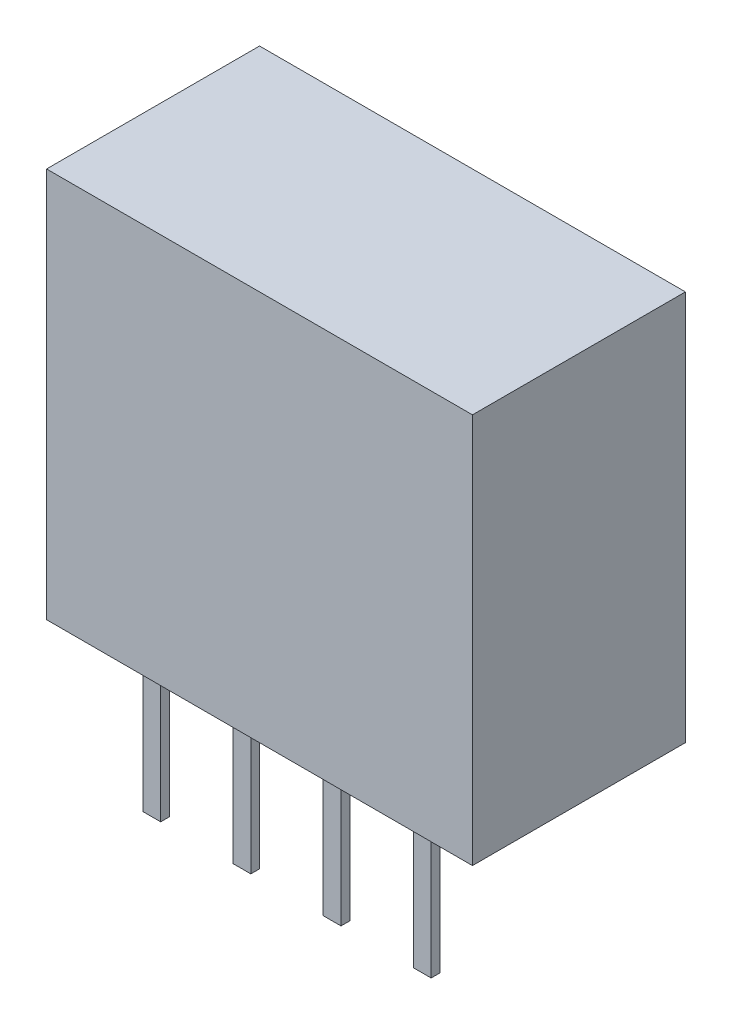
ISO-10303-21;
HEADER;
FILE_DESCRIPTION(('STEP AP214'),'2;1');
FILE_NAME('part.step','',(''),(''),'','','');
FILE_SCHEMA(('AUTOMOTIVE_DESIGN { 1 0 10303 214 1 1 1 1 }'));
ENDSEC;
DATA;
#1=APPLICATION_CONTEXT('core data for automotive mechanical design processes');
#2=APPLICATION_PROTOCOL_DEFINITION('international standard','automotive_design',2000,#1);
#3=PRODUCT_CONTEXT('',#1,'mechanical');
#4=PRODUCT('Part','Part','',(#3));
#5=PRODUCT_RELATED_PRODUCT_CATEGORY('part','',(#4));
#6=PRODUCT_DEFINITION_FORMATION('','',#4);
#7=PRODUCT_DEFINITION_CONTEXT('part definition',#1,'design');
#8=PRODUCT_DEFINITION('design','',#6,#7);
#9=PRODUCT_DEFINITION_SHAPE('','',#8);
#10=(LENGTH_UNIT() NAMED_UNIT(*) SI_UNIT(.MILLI.,.METRE.));
#11=(NAMED_UNIT(*) PLANE_ANGLE_UNIT() SI_UNIT($,.RADIAN.));
#12=(NAMED_UNIT(*) SI_UNIT($,.STERADIAN.) SOLID_ANGLE_UNIT());
#13=UNCERTAINTY_MEASURE_WITH_UNIT(LENGTH_MEASURE(1.E-05),#10,'distance_accuracy_value','');
#14=(GEOMETRIC_REPRESENTATION_CONTEXT(3) GLOBAL_UNCERTAINTY_ASSIGNED_CONTEXT((#13)) GLOBAL_UNIT_ASSIGNED_CONTEXT((#10,
#11,#12)) REPRESENTATION_CONTEXT('',''));
#15=CARTESIAN_POINT('',(0.,0.,0.));
#16=DIRECTION('',(0.,0.,1.));
#17=DIRECTION('',(1.,0.,0.));
#18=AXIS2_PLACEMENT_3D('',#15,#16,#17);
#19=CARTESIAN_POINT('',(-6.00000000000001,-5.5,6.));
#20=DIRECTION('',(0.,1.,0.));
#21=DIRECTION('',(0.,0.,1.));
#22=AXIS2_PLACEMENT_3D('',#19,#20,#21);
#23=PLANE('',#22);
#24=DIRECTION('',(0.,0.,1.));
#25=VECTOR('',#24,1.);
#26=CARTESIAN_POINT('',(-1.02000000000001,-5.5,5.22499999999997));
#27=LINE('',#26,#25);
#28=CARTESIAN_POINT('',(-1.02000000000001,-5.5,4.97499999999997));
#29=VERTEX_POINT('',#28);
#30=CARTESIAN_POINT('',(-1.02000000000001,-5.5,5.22499999999997));
#31=VERTEX_POINT('',#30);
#32=EDGE_CURVE('E191',#29,#31,#27,.T.);
#33=ORIENTED_EDGE('',*,*,#32,.F.);
#34=DIRECTION('',(1.,0.,0.));
#35=VECTOR('',#34,1.);
#36=CARTESIAN_POINT('',(-1.52000000000001,-5.5,4.97499999999997));
#37=LINE('',#36,#35);
#38=CARTESIAN_POINT('',(-1.52000000000001,-5.5,4.97499999999997));
#39=VERTEX_POINT('',#38);
#40=EDGE_CURVE('E204',#39,#29,#37,.T.);
#41=ORIENTED_EDGE('',*,*,#40,.F.);
#42=DIRECTION('',(0.,0.,-1.));
#43=VECTOR('',#42,1.);
#44=CARTESIAN_POINT('',(-1.52000000000001,-5.5,5.22499999999997));
#45=LINE('',#44,#43);
#46=CARTESIAN_POINT('',(-1.52000000000001,-5.5,5.22499999999997));
#47=VERTEX_POINT('',#46);
#48=EDGE_CURVE('E213',#47,#39,#45,.T.);
#49=ORIENTED_EDGE('',*,*,#48,.F.);
#50=DIRECTION('',(-1.,0.,0.));
#51=VECTOR('',#50,1.);
#52=CARTESIAN_POINT('',(-1.52000000000001,-5.5,5.22499999999997));
#53=LINE('',#52,#51);
#54=EDGE_CURVE('E194',#31,#47,#53,.T.);
#55=ORIENTED_EDGE('',*,*,#54,.F.);
#56=EDGE_LOOP('',(#33,#41,#49,#55));
#57=FACE_BOUND('',#56,.T.);
#58=DIRECTION('',(0.,0.,1.));
#59=VECTOR('',#58,1.);
#60=CARTESIAN_POINT('',(4.05999999999999,-5.5,5.225));
#61=LINE('',#60,#59);
#62=CARTESIAN_POINT('',(4.05999999999999,-5.5,4.975));
#63=VERTEX_POINT('',#62);
#64=CARTESIAN_POINT('',(4.05999999999999,-5.5,5.225));
#65=VERTEX_POINT('',#64);
#66=EDGE_CURVE('E262',#63,#65,#61,.T.);
#67=ORIENTED_EDGE('',*,*,#66,.F.);
#68=DIRECTION('',(1.,0.,0.));
#69=VECTOR('',#68,1.);
#70=CARTESIAN_POINT('',(3.55999999999999,-5.5,4.975));
#71=LINE('',#70,#69);
#72=CARTESIAN_POINT('',(3.55999999999999,-5.5,4.975));
#73=VERTEX_POINT('',#72);
#74=EDGE_CURVE('E267',#73,#63,#71,.T.);
#75=ORIENTED_EDGE('',*,*,#74,.F.);
#76=DIRECTION('',(0.,0.,-1.));
#77=VECTOR('',#76,1.);
#78=CARTESIAN_POINT('',(3.55999999999999,-5.5,5.225));
#79=LINE('',#78,#77);
#80=CARTESIAN_POINT('',(3.55999999999999,-5.5,5.225));
#81=VERTEX_POINT('',#80);
#82=EDGE_CURVE('E279',#81,#73,#79,.T.);
#83=ORIENTED_EDGE('',*,*,#82,.F.);
#84=DIRECTION('',(-1.,0.,0.));
#85=VECTOR('',#84,1.);
#86=CARTESIAN_POINT('',(3.55999999999999,-5.5,5.225));
#87=LINE('',#86,#85);
#88=EDGE_CURVE('E276',#65,#81,#87,.T.);
#89=ORIENTED_EDGE('',*,*,#88,.F.);
#90=EDGE_LOOP('',(#67,#75,#83,#89));
#91=FACE_BOUND('',#90,.T.);
#92=DIRECTION('',(1.,0.,0.));
#93=VECTOR('',#92,1.);
#94=CARTESIAN_POINT('',(-6.00000000000001,-5.5,0.));
#95=LINE('',#94,#93);
#96=CARTESIAN_POINT('',(-6.00000000000001,-5.5,0.));
#97=VERTEX_POINT('',#96);
#98=CARTESIAN_POINT('',(5.99999999999999,-5.5,0.));
#99=VERTEX_POINT('',#98);
#100=EDGE_CURVE('E300',#97,#99,#95,.T.);
#101=ORIENTED_EDGE('',*,*,#100,.T.);
#102=DIRECTION('',(0.,0.,-1.));
#103=VECTOR('',#102,1.);
#104=CARTESIAN_POINT('',(5.99999999999999,-5.5,6.));
#105=LINE('',#104,#103);
#106=CARTESIAN_POINT('',(5.99999999999999,-5.5,6.));
#107=VERTEX_POINT('',#106);
#108=EDGE_CURVE('E306',#107,#99,#105,.T.);
#109=ORIENTED_EDGE('',*,*,#108,.F.);
#110=DIRECTION('',(1.,0.,0.));
#111=VECTOR('',#110,1.);
#112=CARTESIAN_POINT('',(-6.00000000000001,-5.5,6.));
#113=LINE('',#112,#111);
#114=CARTESIAN_POINT('',(-6.00000000000001,-5.5,6.));
#115=VERTEX_POINT('',#114);
#116=EDGE_CURVE('E304',#115,#107,#113,.T.);
#117=ORIENTED_EDGE('',*,*,#116,.F.);
#118=DIRECTION('',(0.,0.,-1.));
#119=VECTOR('',#118,1.);
#120=CARTESIAN_POINT('',(-6.00000000000001,-5.5,6.));
#121=LINE('',#120,#119);
#122=EDGE_CURVE('E316',#115,#97,#121,.T.);
#123=ORIENTED_EDGE('',*,*,#122,.T.);
#124=EDGE_LOOP('',(#101,#109,#117,#123));
#125=FACE_BOUND('',#124,.T.);
#126=DIRECTION('',(0.,0.,1.));
#127=VECTOR('',#126,1.);
#128=CARTESIAN_POINT('',(1.51999999999999,-5.5,5.22499999999998));
#129=LINE('',#128,#127);
#130=CARTESIAN_POINT('',(1.51999999999999,-5.5,4.97499999999998));
#131=VERTEX_POINT('',#130);
#132=CARTESIAN_POINT('',(1.51999999999999,-5.5,5.22499999999998));
#133=VERTEX_POINT('',#132);
#134=EDGE_CURVE('E229',#131,#133,#129,.T.);
#135=ORIENTED_EDGE('',*,*,#134,.F.);
#136=DIRECTION('',(1.,0.,0.));
#137=VECTOR('',#136,1.);
#138=CARTESIAN_POINT('',(1.01999999999999,-5.5,4.97499999999998));
#139=LINE('',#138,#137);
#140=CARTESIAN_POINT('',(1.01999999999999,-5.5,4.97499999999998));
#141=VERTEX_POINT('',#140);
#142=EDGE_CURVE('E234',#141,#131,#139,.T.);
#143=ORIENTED_EDGE('',*,*,#142,.F.);
#144=DIRECTION('',(0.,0.,-1.));
#145=VECTOR('',#144,1.);
#146=CARTESIAN_POINT('',(1.01999999999999,-5.5,5.22499999999998));
#147=LINE('',#146,#145);
#148=CARTESIAN_POINT('',(1.01999999999999,-5.5,5.22499999999998));
#149=VERTEX_POINT('',#148);
#150=EDGE_CURVE('E246',#149,#141,#147,.T.);
#151=ORIENTED_EDGE('',*,*,#150,.F.);
#152=DIRECTION('',(-1.,0.,0.));
#153=VECTOR('',#152,1.);
#154=CARTESIAN_POINT('',(1.01999999999999,-5.5,5.22499999999998));
#155=LINE('',#154,#153);
#156=EDGE_CURVE('E243',#133,#149,#155,.T.);
#157=ORIENTED_EDGE('',*,*,#156,.F.);
#158=EDGE_LOOP('',(#135,#143,#151,#157));
#159=FACE_BOUND('',#158,.T.);
#160=DIRECTION('',(0.,0.,1.));
#161=VECTOR('',#160,1.);
#162=CARTESIAN_POINT('',(-3.56,-5.5,5.22499999999995));
#163=LINE('',#162,#161);
#164=CARTESIAN_POINT('',(-3.56,-5.5,4.97499999999995));
#165=VERTEX_POINT('',#164);
#166=CARTESIAN_POINT('',(-3.56,-5.5,5.22499999999995));
#167=VERTEX_POINT('',#166);
#168=EDGE_CURVE('E190',#165,#167,#163,.T.);
#169=ORIENTED_EDGE('',*,*,#168,.F.);
#170=DIRECTION('',(1.,0.,0.));
#171=VECTOR('',#170,1.);
#172=CARTESIAN_POINT('',(-4.06,-5.5,4.97499999999995));
#173=LINE('',#172,#171);
#174=CARTESIAN_POINT('',(-4.06,-5.5,4.97499999999995));
#175=VERTEX_POINT('',#174);
#176=EDGE_CURVE('E187',#175,#165,#173,.T.);
#177=ORIENTED_EDGE('',*,*,#176,.F.);
#178=DIRECTION('',(0.,0.,-1.));
#179=VECTOR('',#178,1.);
#180=CARTESIAN_POINT('',(-4.06,-5.5,5.22499999999995));
#181=LINE('',#180,#179);
#182=CARTESIAN_POINT('',(-4.06,-5.5,5.22499999999995));
#183=VERTEX_POINT('',#182);
#184=EDGE_CURVE('E53',#183,#175,#181,.T.);
#185=ORIENTED_EDGE('',*,*,#184,.F.);
#186=DIRECTION('',(-1.,0.,0.));
#187=VECTOR('',#186,1.);
#188=CARTESIAN_POINT('',(-4.06,-5.5,5.22499999999995));
#189=LINE('',#188,#187);
#190=EDGE_CURVE('E48',#167,#183,#189,.T.);
#191=ORIENTED_EDGE('',*,*,#190,.F.);
#192=EDGE_LOOP('',(#169,#177,#185,#191));
#193=FACE_BOUND('',#192,.T.);
#194=ADVANCED_FACE('F33',(#57,#91,#125,#159,#193),#23,.F.);
#195=CARTESIAN_POINT('',(5.99999999999999,5.5,6.));
#196=DIRECTION('',(-1.,0.,0.));
#197=DIRECTION('',(0.,-1.,0.));
#198=AXIS2_PLACEMENT_3D('',#195,#196,#197);
#199=PLANE('',#198);
#200=DIRECTION('',(0.,1.,0.));
#201=VECTOR('',#200,1.);
#202=CARTESIAN_POINT('',(5.99999999999999,5.5,0.));
#203=LINE('',#202,#201);
#204=CARTESIAN_POINT('',(5.99999999999999,5.5,0.));
#205=VERTEX_POINT('',#204);
#206=EDGE_CURVE('E295',#99,#205,#203,.T.);
#207=ORIENTED_EDGE('',*,*,#206,.T.);
#208=DIRECTION('',(0.,0.,-1.));
#209=VECTOR('',#208,1.);
#210=CARTESIAN_POINT('',(5.99999999999999,5.5,6.));
#211=LINE('',#210,#209);
#212=CARTESIAN_POINT('',(5.99999999999999,5.5,6.));
#213=VERTEX_POINT('',#212);
#214=EDGE_CURVE('E11',#213,#205,#211,.T.);
#215=ORIENTED_EDGE('',*,*,#214,.F.);
#216=DIRECTION('',(0.,1.,0.));
#217=VECTOR('',#216,1.);
#218=CARTESIAN_POINT('',(5.99999999999999,5.5,6.));
#219=LINE('',#218,#217);
#220=EDGE_CURVE('E296',#107,#213,#219,.T.);
#221=ORIENTED_EDGE('',*,*,#220,.F.);
#222=ORIENTED_EDGE('',*,*,#108,.T.);
#223=EDGE_LOOP('',(#207,#215,#221,#222));
#224=FACE_BOUND('',#223,.T.);
#225=ADVANCED_FACE('F35',(#224),#199,.F.);
#226=CARTESIAN_POINT('',(-6.00000000000001,5.5,6.));
#227=DIRECTION('',(0.,-1.,0.));
#228=DIRECTION('',(0.,0.,-1.));
#229=AXIS2_PLACEMENT_3D('',#226,#227,#228);
#230=PLANE('',#229);
#231=DIRECTION('',(-1.,0.,0.));
#232=VECTOR('',#231,1.);
#233=CARTESIAN_POINT('',(-6.00000000000001,5.5,0.));
#234=LINE('',#233,#232);
#235=CARTESIAN_POINT('',(-6.00000000000001,5.5,0.));
#236=VERTEX_POINT('',#235);
#237=EDGE_CURVE('E309',#205,#236,#234,.T.);
#238=ORIENTED_EDGE('',*,*,#237,.T.);
#239=DIRECTION('',(0.,0.,-1.));
#240=VECTOR('',#239,1.);
#241=CARTESIAN_POINT('',(-6.00000000000001,5.5,6.));
#242=LINE('',#241,#240);
#243=CARTESIAN_POINT('',(-6.00000000000001,5.5,6.));
#244=VERTEX_POINT('',#243);
#245=EDGE_CURVE('E41',#244,#236,#242,.T.);
#246=ORIENTED_EDGE('',*,*,#245,.F.);
#247=DIRECTION('',(-1.,0.,0.));
#248=VECTOR('',#247,1.);
#249=CARTESIAN_POINT('',(-6.00000000000001,5.5,6.));
#250=LINE('',#249,#248);
#251=EDGE_CURVE('E299',#213,#244,#250,.T.);
#252=ORIENTED_EDGE('',*,*,#251,.F.);
#253=ORIENTED_EDGE('',*,*,#214,.T.);
#254=EDGE_LOOP('',(#238,#246,#252,#253));
#255=FACE_BOUND('',#254,.T.);
#256=ADVANCED_FACE('F339',(#255),#230,.F.);
#257=CARTESIAN_POINT('',(-6.00000000000001,5.5,6.));
#258=DIRECTION('',(1.,0.,0.));
#259=DIRECTION('',(0.,1.,0.));
#260=AXIS2_PLACEMENT_3D('',#257,#258,#259);
#261=PLANE('',#260);
#262=DIRECTION('',(0.,-1.,0.));
#263=VECTOR('',#262,1.);
#264=CARTESIAN_POINT('',(-6.00000000000001,5.5,0.));
#265=LINE('',#264,#263);
#266=EDGE_CURVE('E311',#236,#97,#265,.T.);
#267=ORIENTED_EDGE('',*,*,#266,.T.);
#268=ORIENTED_EDGE('',*,*,#122,.F.);
#269=DIRECTION('',(0.,-1.,0.));
#270=VECTOR('',#269,1.);
#271=CARTESIAN_POINT('',(-6.00000000000001,5.5,6.));
#272=LINE('',#271,#270);
#273=EDGE_CURVE('E302',#244,#115,#272,.T.);
#274=ORIENTED_EDGE('',*,*,#273,.F.);
#275=ORIENTED_EDGE('',*,*,#245,.T.);
#276=EDGE_LOOP('',(#267,#268,#274,#275));
#277=FACE_BOUND('',#276,.T.);
#278=ADVANCED_FACE('F323',(#277),#261,.F.);
#279=CARTESIAN_POINT('',(0.,0.,6.));
#280=DIRECTION('',(0.,0.,1.));
#281=DIRECTION('',(1.,0.,0.));
#282=AXIS2_PLACEMENT_3D('',#279,#280,#281);
#283=PLANE('',#282);
#284=ORIENTED_EDGE('',*,*,#220,.T.);
#285=ORIENTED_EDGE('',*,*,#251,.T.);
#286=ORIENTED_EDGE('',*,*,#273,.T.);
#287=ORIENTED_EDGE('',*,*,#116,.T.);
#288=EDGE_LOOP('',(#284,#285,#286,#287));
#289=FACE_BOUND('',#288,.T.);
#290=ADVANCED_FACE('F338',(#289),#283,.T.);
#291=CARTESIAN_POINT('',(0.,0.,0.));
#292=DIRECTION('',(0.,0.,1.));
#293=DIRECTION('',(1.,0.,0.));
#294=AXIS2_PLACEMENT_3D('',#291,#292,#293);
#295=PLANE('',#294);
#296=ORIENTED_EDGE('',*,*,#206,.F.);
#297=ORIENTED_EDGE('',*,*,#100,.F.);
#298=ORIENTED_EDGE('',*,*,#266,.F.);
#299=ORIENTED_EDGE('',*,*,#237,.F.);
#300=EDGE_LOOP('',(#296,#297,#298,#299));
#301=FACE_BOUND('',#300,.T.);
#302=ADVANCED_FACE('F329',(#301),#295,.F.);
#303=CARTESIAN_POINT('',(4.05999999999999,-9.6,5.225));
#304=DIRECTION('',(-1.,0.,0.));
#305=DIRECTION('',(0.,0.,1.));
#306=AXIS2_PLACEMENT_3D('',#303,#304,#305);
#307=PLANE('',#306);
#308=ORIENTED_EDGE('',*,*,#66,.T.);
#309=DIRECTION('',(0.,1.,0.));
#310=VECTOR('',#309,1.);
#311=CARTESIAN_POINT('',(4.05999999999999,-9.6,5.225));
#312=LINE('',#311,#310);
#313=CARTESIAN_POINT('',(4.05999999999999,-9.6,5.225));
#314=VERTEX_POINT('',#313);
#315=EDGE_CURVE('E292',#314,#65,#312,.T.);
#316=ORIENTED_EDGE('',*,*,#315,.F.);
#317=DIRECTION('',(0.,0.,1.));
#318=VECTOR('',#317,1.);
#319=CARTESIAN_POINT('',(4.05999999999999,-9.6,5.225));
#320=LINE('',#319,#318);
#321=CARTESIAN_POINT('',(4.05999999999999,-9.6,4.975));
#322=VERTEX_POINT('',#321);
#323=EDGE_CURVE('E263',#322,#314,#320,.T.);
#324=ORIENTED_EDGE('',*,*,#323,.F.);
#325=DIRECTION('',(0.,1.,0.));
#326=VECTOR('',#325,1.);
#327=CARTESIAN_POINT('',(4.05999999999999,-9.6,4.975));
#328=LINE('',#327,#326);
#329=EDGE_CURVE('E273',#322,#63,#328,.T.);
#330=ORIENTED_EDGE('',*,*,#329,.T.);
#331=EDGE_LOOP('',(#308,#316,#324,#330));
#332=FACE_BOUND('',#331,.T.);
#333=ADVANCED_FACE('F355',(#332),#307,.F.);
#334=CARTESIAN_POINT('',(3.55999999999999,-9.6,5.225));
#335=DIRECTION('',(0.,0.,-1.));
#336=DIRECTION('',(-1.,0.,0.));
#337=AXIS2_PLACEMENT_3D('',#334,#335,#336);
#338=PLANE('',#337);
#339=ORIENTED_EDGE('',*,*,#88,.T.);
#340=DIRECTION('',(0.,1.,0.));
#341=VECTOR('',#340,1.);
#342=CARTESIAN_POINT('',(3.55999999999999,-9.6,5.225));
#343=LINE('',#342,#341);
#344=CARTESIAN_POINT('',(3.55999999999999,-9.6,5.225));
#345=VERTEX_POINT('',#344);
#346=EDGE_CURVE('E289',#345,#81,#343,.T.);
#347=ORIENTED_EDGE('',*,*,#346,.F.);
#348=DIRECTION('',(-1.,0.,0.));
#349=VECTOR('',#348,1.);
#350=CARTESIAN_POINT('',(3.55999999999999,-9.6,5.225));
#351=LINE('',#350,#349);
#352=EDGE_CURVE('E266',#314,#345,#351,.T.);
#353=ORIENTED_EDGE('',*,*,#352,.F.);
#354=ORIENTED_EDGE('',*,*,#315,.T.);
#355=EDGE_LOOP('',(#339,#347,#353,#354));
#356=FACE_BOUND('',#355,.T.);
#357=ADVANCED_FACE('F360',(#356),#338,.F.);
#358=CARTESIAN_POINT('',(3.55999999999999,-9.6,5.225));
#359=DIRECTION('',(1.,0.,0.));
#360=DIRECTION('',(0.,0.,-1.));
#361=AXIS2_PLACEMENT_3D('',#358,#359,#360);
#362=PLANE('',#361);
#363=ORIENTED_EDGE('',*,*,#82,.T.);
#364=DIRECTION('',(0.,1.,0.));
#365=VECTOR('',#364,1.);
#366=CARTESIAN_POINT('',(3.55999999999999,-9.6,4.975));
#367=LINE('',#366,#365);
#368=CARTESIAN_POINT('',(3.55999999999999,-9.6,4.975));
#369=VERTEX_POINT('',#368);
#370=EDGE_CURVE('E286',#369,#73,#367,.T.);
#371=ORIENTED_EDGE('',*,*,#370,.F.);
#372=DIRECTION('',(0.,0.,-1.));
#373=VECTOR('',#372,1.);
#374=CARTESIAN_POINT('',(3.55999999999999,-9.6,5.225));
#375=LINE('',#374,#373);
#376=EDGE_CURVE('E269',#345,#369,#375,.T.);
#377=ORIENTED_EDGE('',*,*,#376,.F.);
#378=ORIENTED_EDGE('',*,*,#346,.T.);
#379=EDGE_LOOP('',(#363,#371,#377,#378));
#380=FACE_BOUND('',#379,.T.);
#381=ADVANCED_FACE('F364',(#380),#362,.F.);
#382=CARTESIAN_POINT('',(3.55999999999999,-9.6,4.975));
#383=DIRECTION('',(0.,0.,1.));
#384=DIRECTION('',(1.,0.,0.));
#385=AXIS2_PLACEMENT_3D('',#382,#383,#384);
#386=PLANE('',#385);
#387=ORIENTED_EDGE('',*,*,#74,.T.);
#388=ORIENTED_EDGE('',*,*,#329,.F.);
#389=DIRECTION('',(1.,0.,0.));
#390=VECTOR('',#389,1.);
#391=CARTESIAN_POINT('',(3.55999999999999,-9.6,4.975));
#392=LINE('',#391,#390);
#393=EDGE_CURVE('E271',#369,#322,#392,.T.);
#394=ORIENTED_EDGE('',*,*,#393,.F.);
#395=ORIENTED_EDGE('',*,*,#370,.T.);
#396=EDGE_LOOP('',(#387,#388,#394,#395));
#397=FACE_BOUND('',#396,.T.);
#398=ADVANCED_FACE('F368',(#397),#386,.F.);
#399=CARTESIAN_POINT('',(0.,-9.6,0.));
#400=DIRECTION('',(0.,-1.,0.));
#401=DIRECTION('',(0.,0.,-1.));
#402=AXIS2_PLACEMENT_3D('',#399,#400,#401);
#403=PLANE('',#402);
#404=ORIENTED_EDGE('',*,*,#323,.T.);
#405=ORIENTED_EDGE('',*,*,#352,.T.);
#406=ORIENTED_EDGE('',*,*,#376,.T.);
#407=ORIENTED_EDGE('',*,*,#393,.T.);
#408=EDGE_LOOP('',(#404,#405,#406,#407));
#409=FACE_BOUND('',#408,.T.);
#410=ADVANCED_FACE('F372',(#409),#403,.T.);
#411=CARTESIAN_POINT('',(1.51999999999999,-9.6,5.22499999999998));
#412=DIRECTION('',(-1.,0.,0.));
#413=DIRECTION('',(0.,0.,1.));
#414=AXIS2_PLACEMENT_3D('',#411,#412,#413);
#415=PLANE('',#414);
#416=ORIENTED_EDGE('',*,*,#134,.T.);
#417=DIRECTION('',(0.,1.,0.));
#418=VECTOR('',#417,1.);
#419=CARTESIAN_POINT('',(1.51999999999999,-9.6,5.22499999999998));
#420=LINE('',#419,#418);
#421=CARTESIAN_POINT('',(1.51999999999999,-9.6,5.22499999999998));
#422=VERTEX_POINT('',#421);
#423=EDGE_CURVE('E259',#422,#133,#420,.T.);
#424=ORIENTED_EDGE('',*,*,#423,.F.);
#425=DIRECTION('',(0.,0.,1.));
#426=VECTOR('',#425,1.);
#427=CARTESIAN_POINT('',(1.51999999999999,-9.6,5.22499999999998));
#428=LINE('',#427,#426);
#429=CARTESIAN_POINT('',(1.51999999999999,-9.6,4.97499999999998));
#430=VERTEX_POINT('',#429);
#431=EDGE_CURVE('E230',#430,#422,#428,.T.);
#432=ORIENTED_EDGE('',*,*,#431,.F.);
#433=DIRECTION('',(0.,1.,0.));
#434=VECTOR('',#433,1.);
#435=CARTESIAN_POINT('',(1.51999999999999,-9.6,4.97499999999998));
#436=LINE('',#435,#434);
#437=EDGE_CURVE('E240',#430,#131,#436,.T.);
#438=ORIENTED_EDGE('',*,*,#437,.T.);
#439=EDGE_LOOP('',(#416,#424,#432,#438));
#440=FACE_BOUND('',#439,.T.);
#441=ADVANCED_FACE('F376',(#440),#415,.F.);
#442=CARTESIAN_POINT('',(1.01999999999999,-9.6,5.22499999999998));
#443=DIRECTION('',(0.,0.,-1.));
#444=DIRECTION('',(-1.,0.,0.));
#445=AXIS2_PLACEMENT_3D('',#442,#443,#444);
#446=PLANE('',#445);
#447=ORIENTED_EDGE('',*,*,#156,.T.);
#448=DIRECTION('',(0.,1.,0.));
#449=VECTOR('',#448,1.);
#450=CARTESIAN_POINT('',(1.01999999999999,-9.6,5.22499999999998));
#451=LINE('',#450,#449);
#452=CARTESIAN_POINT('',(1.01999999999999,-9.6,5.22499999999998));
#453=VERTEX_POINT('',#452);
#454=EDGE_CURVE('E256',#453,#149,#451,.T.);
#455=ORIENTED_EDGE('',*,*,#454,.F.);
#456=DIRECTION('',(-1.,0.,0.));
#457=VECTOR('',#456,1.);
#458=CARTESIAN_POINT('',(1.01999999999999,-9.6,5.22499999999998));
#459=LINE('',#458,#457);
#460=EDGE_CURVE('E233',#422,#453,#459,.T.);
#461=ORIENTED_EDGE('',*,*,#460,.F.);
#462=ORIENTED_EDGE('',*,*,#423,.T.);
#463=EDGE_LOOP('',(#447,#455,#461,#462));
#464=FACE_BOUND('',#463,.T.);
#465=ADVANCED_FACE('F380',(#464),#446,.F.);
#466=CARTESIAN_POINT('',(1.01999999999999,-9.6,5.22499999999998));
#467=DIRECTION('',(1.,0.,0.));
#468=DIRECTION('',(0.,0.,-1.));
#469=AXIS2_PLACEMENT_3D('',#466,#467,#468);
#470=PLANE('',#469);
#471=ORIENTED_EDGE('',*,*,#150,.T.);
#472=DIRECTION('',(0.,1.,0.));
#473=VECTOR('',#472,1.);
#474=CARTESIAN_POINT('',(1.01999999999999,-9.6,4.97499999999998));
#475=LINE('',#474,#473);
#476=CARTESIAN_POINT('',(1.01999999999999,-9.6,4.97499999999998));
#477=VERTEX_POINT('',#476);
#478=EDGE_CURVE('E253',#477,#141,#475,.T.);
#479=ORIENTED_EDGE('',*,*,#478,.F.);
#480=DIRECTION('',(0.,0.,-1.));
#481=VECTOR('',#480,1.);
#482=CARTESIAN_POINT('',(1.01999999999999,-9.6,5.22499999999998));
#483=LINE('',#482,#481);
#484=EDGE_CURVE('E236',#453,#477,#483,.T.);
#485=ORIENTED_EDGE('',*,*,#484,.F.);
#486=ORIENTED_EDGE('',*,*,#454,.T.);
#487=EDGE_LOOP('',(#471,#479,#485,#486));
#488=FACE_BOUND('',#487,.T.);
#489=ADVANCED_FACE('F384',(#488),#470,.F.);
#490=CARTESIAN_POINT('',(1.01999999999999,-9.6,4.97499999999998));
#491=DIRECTION('',(0.,0.,1.));
#492=DIRECTION('',(1.,0.,0.));
#493=AXIS2_PLACEMENT_3D('',#490,#491,#492);
#494=PLANE('',#493);
#495=ORIENTED_EDGE('',*,*,#142,.T.);
#496=ORIENTED_EDGE('',*,*,#437,.F.);
#497=DIRECTION('',(1.,0.,0.));
#498=VECTOR('',#497,1.);
#499=CARTESIAN_POINT('',(1.01999999999999,-9.6,4.97499999999998));
#500=LINE('',#499,#498);
#501=EDGE_CURVE('E238',#477,#430,#500,.T.);
#502=ORIENTED_EDGE('',*,*,#501,.F.);
#503=ORIENTED_EDGE('',*,*,#478,.T.);
#504=EDGE_LOOP('',(#495,#496,#502,#503));
#505=FACE_BOUND('',#504,.T.);
#506=ADVANCED_FACE('F388',(#505),#494,.F.);
#507=CARTESIAN_POINT('',(0.,-9.6,0.));
#508=DIRECTION('',(0.,-1.,0.));
#509=DIRECTION('',(0.,0.,-1.));
#510=AXIS2_PLACEMENT_3D('',#507,#508,#509);
#511=PLANE('',#510);
#512=ORIENTED_EDGE('',*,*,#431,.T.);
#513=ORIENTED_EDGE('',*,*,#460,.T.);
#514=ORIENTED_EDGE('',*,*,#484,.T.);
#515=ORIENTED_EDGE('',*,*,#501,.T.);
#516=EDGE_LOOP('',(#512,#513,#514,#515));
#517=FACE_BOUND('',#516,.T.);
#518=ADVANCED_FACE('F392',(#517),#511,.T.);
#519=CARTESIAN_POINT('',(-1.02000000000001,-9.6,5.22499999999997));
#520=DIRECTION('',(-1.,0.,0.));
#521=DIRECTION('',(0.,0.,1.));
#522=AXIS2_PLACEMENT_3D('',#519,#520,#521);
#523=PLANE('',#522);
#524=ORIENTED_EDGE('',*,*,#32,.T.);
#525=DIRECTION('',(0.,1.,0.));
#526=VECTOR('',#525,1.);
#527=CARTESIAN_POINT('',(-1.02000000000001,-9.6,5.22499999999997));
#528=LINE('',#527,#526);
#529=CARTESIAN_POINT('',(-1.02000000000001,-9.6,5.22499999999997));
#530=VERTEX_POINT('',#529);
#531=EDGE_CURVE('E226',#530,#31,#528,.T.);
#532=ORIENTED_EDGE('',*,*,#531,.F.);
#533=DIRECTION('',(0.,0.,1.));
#534=VECTOR('',#533,1.);
#535=CARTESIAN_POINT('',(-1.02000000000001,-9.6,5.22499999999997));
#536=LINE('',#535,#534);
#537=CARTESIAN_POINT('',(-1.02000000000001,-9.6,4.97499999999997));
#538=VERTEX_POINT('',#537);
#539=EDGE_CURVE('E200',#538,#530,#536,.T.);
#540=ORIENTED_EDGE('',*,*,#539,.F.);
#541=DIRECTION('',(0.,1.,0.));
#542=VECTOR('',#541,1.);
#543=CARTESIAN_POINT('',(-1.02000000000001,-9.6,4.97499999999997));
#544=LINE('',#543,#542);
#545=EDGE_CURVE('E209',#538,#29,#544,.T.);
#546=ORIENTED_EDGE('',*,*,#545,.T.);
#547=EDGE_LOOP('',(#524,#532,#540,#546));
#548=FACE_BOUND('',#547,.T.);
#549=ADVANCED_FACE('F396',(#548),#523,.F.);
#550=CARTESIAN_POINT('',(-1.52000000000001,-9.6,5.22499999999997));
#551=DIRECTION('',(0.,0.,-1.));
#552=DIRECTION('',(-1.,0.,0.));
#553=AXIS2_PLACEMENT_3D('',#550,#551,#552);
#554=PLANE('',#553);
#555=ORIENTED_EDGE('',*,*,#54,.T.);
#556=DIRECTION('',(0.,1.,0.));
#557=VECTOR('',#556,1.);
#558=CARTESIAN_POINT('',(-1.52000000000001,-9.6,5.22499999999997));
#559=LINE('',#558,#557);
#560=CARTESIAN_POINT('',(-1.52000000000001,-9.6,5.22499999999997));
#561=VERTEX_POINT('',#560);
#562=EDGE_CURVE('E223',#561,#47,#559,.T.);
#563=ORIENTED_EDGE('',*,*,#562,.F.);
#564=DIRECTION('',(-1.,0.,0.));
#565=VECTOR('',#564,1.);
#566=CARTESIAN_POINT('',(-1.52000000000001,-9.6,5.22499999999997));
#567=LINE('',#566,#565);
#568=EDGE_CURVE('E203',#530,#561,#567,.T.);
#569=ORIENTED_EDGE('',*,*,#568,.F.);
#570=ORIENTED_EDGE('',*,*,#531,.T.);
#571=EDGE_LOOP('',(#555,#563,#569,#570));
#572=FACE_BOUND('',#571,.T.);
#573=ADVANCED_FACE('F400',(#572),#554,.F.);
#574=CARTESIAN_POINT('',(-1.52000000000001,-9.6,5.22499999999997));
#575=DIRECTION('',(1.,0.,0.));
#576=DIRECTION('',(0.,0.,-1.));
#577=AXIS2_PLACEMENT_3D('',#574,#575,#576);
#578=PLANE('',#577);
#579=ORIENTED_EDGE('',*,*,#48,.T.);
#580=DIRECTION('',(0.,1.,0.));
#581=VECTOR('',#580,1.);
#582=CARTESIAN_POINT('',(-1.52000000000001,-9.6,4.97499999999997));
#583=LINE('',#582,#581);
#584=CARTESIAN_POINT('',(-1.52000000000001,-9.6,4.97499999999997));
#585=VERTEX_POINT('',#584);
#586=EDGE_CURVE('E220',#585,#39,#583,.T.);
#587=ORIENTED_EDGE('',*,*,#586,.F.);
#588=DIRECTION('',(0.,0.,-1.));
#589=VECTOR('',#588,1.);
#590=CARTESIAN_POINT('',(-1.52000000000001,-9.6,5.22499999999997));
#591=LINE('',#590,#589);
#592=EDGE_CURVE('E206',#561,#585,#591,.T.);
#593=ORIENTED_EDGE('',*,*,#592,.F.);
#594=ORIENTED_EDGE('',*,*,#562,.T.);
#595=EDGE_LOOP('',(#579,#587,#593,#594));
#596=FACE_BOUND('',#595,.T.);
#597=ADVANCED_FACE('F404',(#596),#578,.F.);
#598=CARTESIAN_POINT('',(-1.52000000000001,-9.6,4.97499999999997));
#599=DIRECTION('',(0.,0.,1.));
#600=DIRECTION('',(1.,0.,0.));
#601=AXIS2_PLACEMENT_3D('',#598,#599,#600);
#602=PLANE('',#601);
#603=ORIENTED_EDGE('',*,*,#40,.T.);
#604=ORIENTED_EDGE('',*,*,#545,.F.);
#605=DIRECTION('',(1.,0.,0.));
#606=VECTOR('',#605,1.);
#607=CARTESIAN_POINT('',(-1.52000000000001,-9.6,4.97499999999997));
#608=LINE('',#607,#606);
#609=EDGE_CURVE('E208',#585,#538,#608,.T.);
#610=ORIENTED_EDGE('',*,*,#609,.F.);
#611=ORIENTED_EDGE('',*,*,#586,.T.);
#612=EDGE_LOOP('',(#603,#604,#610,#611));
#613=FACE_BOUND('',#612,.T.);
#614=ADVANCED_FACE('F408',(#613),#602,.F.);
#615=CARTESIAN_POINT('',(0.,-9.6,0.));
#616=DIRECTION('',(0.,-1.,0.));
#617=DIRECTION('',(0.,0.,-1.));
#618=AXIS2_PLACEMENT_3D('',#615,#616,#617);
#619=PLANE('',#618);
#620=ORIENTED_EDGE('',*,*,#539,.T.);
#621=ORIENTED_EDGE('',*,*,#568,.T.);
#622=ORIENTED_EDGE('',*,*,#592,.T.);
#623=ORIENTED_EDGE('',*,*,#609,.T.);
#624=EDGE_LOOP('',(#620,#621,#622,#623));
#625=FACE_BOUND('',#624,.T.);
#626=ADVANCED_FACE('F412',(#625),#619,.T.);
#627=CARTESIAN_POINT('',(-3.56,-9.6,5.22499999999995));
#628=DIRECTION('',(-1.,0.,0.));
#629=DIRECTION('',(0.,0.,1.));
#630=AXIS2_PLACEMENT_3D('',#627,#628,#629);
#631=PLANE('',#630);
#632=ORIENTED_EDGE('',*,*,#168,.T.);
#633=DIRECTION('',(0.,1.,0.));
#634=VECTOR('',#633,1.);
#635=CARTESIAN_POINT('',(-3.56,-9.6,5.22499999999995));
#636=LINE('',#635,#634);
#637=CARTESIAN_POINT('',(-3.56,-9.6,5.22499999999995));
#638=VERTEX_POINT('',#637);
#639=EDGE_CURVE('E171',#638,#167,#636,.T.);
#640=ORIENTED_EDGE('',*,*,#639,.F.);
#641=DIRECTION('',(0.,0.,1.));
#642=VECTOR('',#641,1.);
#643=CARTESIAN_POINT('',(-3.56,-9.6,5.22499999999995));
#644=LINE('',#643,#642);
#645=CARTESIAN_POINT('',(-3.56,-9.6,4.97499999999995));
#646=VERTEX_POINT('',#645);
#647=EDGE_CURVE('E178',#646,#638,#644,.T.);
#648=ORIENTED_EDGE('',*,*,#647,.F.);
#649=DIRECTION('',(0.,1.,0.));
#650=VECTOR('',#649,1.);
#651=CARTESIAN_POINT('',(-3.56,-9.6,4.97499999999995));
#652=LINE('',#651,#650);
#653=EDGE_CURVE('E584',#646,#165,#652,.T.);
#654=ORIENTED_EDGE('',*,*,#653,.T.);
#655=EDGE_LOOP('',(#632,#640,#648,#654));
#656=FACE_BOUND('',#655,.T.);
#657=ADVANCED_FACE('F189',(#656),#631,.F.);
#658=CARTESIAN_POINT('',(-4.06,-9.6,5.22499999999995));
#659=DIRECTION('',(0.,0.,-1.));
#660=DIRECTION('',(-1.,0.,0.));
#661=AXIS2_PLACEMENT_3D('',#658,#659,#660);
#662=PLANE('',#661);
#663=ORIENTED_EDGE('',*,*,#190,.T.);
#664=DIRECTION('',(0.,1.,0.));
#665=VECTOR('',#664,1.);
#666=CARTESIAN_POINT('',(-4.06,-9.6,5.22499999999995));
#667=LINE('',#666,#665);
#668=CARTESIAN_POINT('',(-4.06,-9.6,5.22499999999995));
#669=VERTEX_POINT('',#668);
#670=EDGE_CURVE('E174',#669,#183,#667,.T.);
#671=ORIENTED_EDGE('',*,*,#670,.F.);
#672=DIRECTION('',(-1.,0.,0.));
#673=VECTOR('',#672,1.);
#674=CARTESIAN_POINT('',(-4.06,-9.6,5.22499999999995));
#675=LINE('',#674,#673);
#676=EDGE_CURVE('E167',#638,#669,#675,.T.);
#677=ORIENTED_EDGE('',*,*,#676,.F.);
#678=ORIENTED_EDGE('',*,*,#639,.T.);
#679=EDGE_LOOP('',(#663,#671,#677,#678));
#680=FACE_BOUND('',#679,.T.);
#681=ADVANCED_FACE('F169',(#680),#662,.F.);
#682=CARTESIAN_POINT('',(-4.06,-9.6,5.22499999999995));
#683=DIRECTION('',(1.,0.,0.));
#684=DIRECTION('',(0.,0.,-1.));
#685=AXIS2_PLACEMENT_3D('',#682,#683,#684);
#686=PLANE('',#685);
#687=ORIENTED_EDGE('',*,*,#184,.T.);
#688=DIRECTION('',(0.,1.,0.));
#689=VECTOR('',#688,1.);
#690=CARTESIAN_POINT('',(-4.06,-9.6,4.97499999999995));
#691=LINE('',#690,#689);
#692=CARTESIAN_POINT('',(-4.06,-9.6,4.97499999999995));
#693=VERTEX_POINT('',#692);
#694=EDGE_CURVE('E196',#693,#175,#691,.T.);
#695=ORIENTED_EDGE('',*,*,#694,.F.);
#696=DIRECTION('',(0.,0.,-1.));
#697=VECTOR('',#696,1.);
#698=CARTESIAN_POINT('',(-4.06,-9.6,5.22499999999995));
#699=LINE('',#698,#697);
#700=EDGE_CURVE('E177',#669,#693,#699,.T.);
#701=ORIENTED_EDGE('',*,*,#700,.F.);
#702=ORIENTED_EDGE('',*,*,#670,.T.);
#703=EDGE_LOOP('',(#687,#695,#701,#702));
#704=FACE_BOUND('',#703,.T.);
#705=ADVANCED_FACE('F421',(#704),#686,.F.);
#706=CARTESIAN_POINT('',(-4.06,-9.6,4.97499999999995));
#707=DIRECTION('',(0.,0.,1.));
#708=DIRECTION('',(1.,0.,0.));
#709=AXIS2_PLACEMENT_3D('',#706,#707,#708);
#710=PLANE('',#709);
#711=ORIENTED_EDGE('',*,*,#176,.T.);
#712=ORIENTED_EDGE('',*,*,#653,.F.);
#713=DIRECTION('',(1.,0.,0.));
#714=VECTOR('',#713,1.);
#715=CARTESIAN_POINT('',(-4.06,-9.6,4.97499999999995));
#716=LINE('',#715,#714);
#717=EDGE_CURVE('E183',#693,#646,#716,.T.);
#718=ORIENTED_EDGE('',*,*,#717,.F.);
#719=ORIENTED_EDGE('',*,*,#694,.T.);
#720=EDGE_LOOP('',(#711,#712,#718,#719));
#721=FACE_BOUND('',#720,.T.);
#722=ADVANCED_FACE('F424',(#721),#710,.F.);
#723=CARTESIAN_POINT('',(0.,-9.6,0.));
#724=DIRECTION('',(0.,-1.,0.));
#725=DIRECTION('',(0.,0.,-1.));
#726=AXIS2_PLACEMENT_3D('',#723,#724,#725);
#727=PLANE('',#726);
#728=ORIENTED_EDGE('',*,*,#647,.T.);
#729=ORIENTED_EDGE('',*,*,#676,.T.);
#730=ORIENTED_EDGE('',*,*,#700,.T.);
#731=ORIENTED_EDGE('',*,*,#717,.T.);
#732=EDGE_LOOP('',(#728,#729,#730,#731));
#733=FACE_BOUND('',#732,.T.);
#734=ADVANCED_FACE('F181',(#733),#727,.T.);
#735=CLOSED_SHELL('',(#194,#225,#256,#278,#290,#302,#333,#357,#381,#398,#410,#441,#465,#489,
#506,#518,#549,#573,#597,#614,#626,#657,#681,#705,#722,#734));
#736=MANIFOLD_SOLID_BREP('B2',#735);
#737=ADVANCED_BREP_SHAPE_REPRESENTATION('',(#18,#736),#14);
#738=SHAPE_DEFINITION_REPRESENTATION(#9,#737);
ENDSEC;
END-ISO-10303-21;
